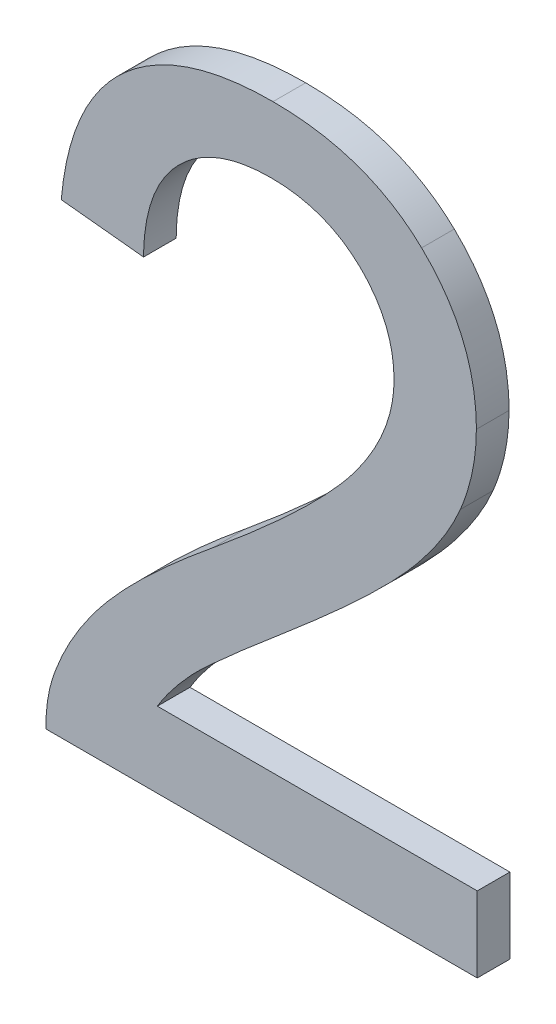
ISO-10303-21;
HEADER;
FILE_DESCRIPTION(('STEP AP214'),'2;1');
FILE_NAME('part.step','',(''),(''),'','','');
FILE_SCHEMA(('AUTOMOTIVE_DESIGN { 1 0 10303 214 1 1 1 1 }'));
ENDSEC;
DATA;
#1=APPLICATION_CONTEXT('core data for automotive mechanical design processes');
#2=APPLICATION_PROTOCOL_DEFINITION('international standard','automotive_design',2000,#1);
#3=PRODUCT_CONTEXT('',#1,'mechanical');
#4=PRODUCT('Part','Part','',(#3));
#5=PRODUCT_RELATED_PRODUCT_CATEGORY('part','',(#4));
#6=PRODUCT_DEFINITION_FORMATION('','',#4);
#7=PRODUCT_DEFINITION_CONTEXT('part definition',#1,'design');
#8=PRODUCT_DEFINITION('design','',#6,#7);
#9=PRODUCT_DEFINITION_SHAPE('','',#8);
#10=(LENGTH_UNIT() NAMED_UNIT(*) SI_UNIT(.MILLI.,.METRE.));
#11=(NAMED_UNIT(*) PLANE_ANGLE_UNIT() SI_UNIT($,.RADIAN.));
#12=(NAMED_UNIT(*) SI_UNIT($,.STERADIAN.) SOLID_ANGLE_UNIT());
#13=UNCERTAINTY_MEASURE_WITH_UNIT(LENGTH_MEASURE(1.E-05),#10,'distance_accuracy_value','');
#14=(GEOMETRIC_REPRESENTATION_CONTEXT(3) GLOBAL_UNCERTAINTY_ASSIGNED_CONTEXT((#13)) GLOBAL_UNIT_ASSIGNED_CONTEXT((#10,
#11,#12)) REPRESENTATION_CONTEXT('',''));
#15=CARTESIAN_POINT('',(0.,0.,0.));
#16=DIRECTION('',(0.,0.,1.));
#17=DIRECTION('',(1.,0.,0.));
#18=AXIS2_PLACEMENT_3D('',#15,#16,#17);
#19=CARTESIAN_POINT('',(10.434995496463,0.46657835894,0.05));
#20=DIRECTION('',(0.,0.,1.));
#21=DIRECTION('',(1.,0.,0.));
#22=AXIS2_PLACEMENT_3D('',#19,#20,#21);
#23=PLANE('',#22);
#24=DIRECTION('',(0.,-1.,0.));
#25=VECTOR('',#24,1.);
#26=CARTESIAN_POINT('',(10.746139171512,0.115552325581,0.05));
#27=LINE('',#26,#25);
#28=CARTESIAN_POINT('',(10.746139171512,0.115552325581,0.05));
#29=VERTEX_POINT('',#28);
#30=CARTESIAN_POINT('',(10.746139171512,0.,0.05));
#31=VERTEX_POINT('',#30);
#32=EDGE_CURVE('E527',#29,#31,#27,.T.);
#33=ORIENTED_EDGE('',*,*,#32,.F.);
#34=DIRECTION('',(1.,0.,0.));
#35=VECTOR('',#34,1.);
#36=CARTESIAN_POINT('',(10.256268168605,0.115552325581,0.05));
#37=LINE('',#36,#35);
#38=CARTESIAN_POINT('',(10.256268168605,0.115552325581,0.05));
#39=VERTEX_POINT('',#38);
#40=EDGE_CURVE('E258',#39,#29,#37,.T.);
#41=ORIENTED_EDGE('',*,*,#40,.F.);
#42=CARTESIAN_POINT('',(10.30804869186,0.182458212209,0.05));
#43=CARTESIAN_POINT('',(10.276707848837,0.149164244186,0.05));
#44=CARTESIAN_POINT('',(10.256268168605,0.115552325581,0.05));
#45=(BOUNDED_CURVE() B_SPLINE_CURVE(2,(#42,#43,#44),.UNSPECIFIED.,.F.,
.F.) B_SPLINE_CURVE_WITH_KNOTS((3,3),(0.,1.),
.UNSPECIFIED.) CURVE() GEOMETRIC_REPRESENTATION_ITEM() RATIONAL_B_SPLINE_CURVE((1.,1.,1.)) REPRESENTATION_ITEM(''));
#46=CARTESIAN_POINT('',(10.30804869186,0.182458212209,0.05));
#47=VERTEX_POINT('',#46);
#48=EDGE_CURVE('E244',#47,#39,#45,.T.);
#49=ORIENTED_EDGE('',*,*,#48,.F.);
#50=CARTESIAN_POINT('',(10.44976380814,0.309047965116,0.05));
#51=CARTESIAN_POINT('',(10.339389534884,0.215752180233,0.05));
#52=CARTESIAN_POINT('',(10.30804869186,0.182458212209,0.05));
#53=(BOUNDED_CURVE() B_SPLINE_CURVE(2,(#50,#51,#52),.UNSPECIFIED.,.F.,
.F.) B_SPLINE_CURVE_WITH_KNOTS((3,3),(0.,1.),
.UNSPECIFIED.) CURVE() GEOMETRIC_REPRESENTATION_ITEM() RATIONAL_B_SPLINE_CURVE((1.,1.,1.)) REPRESENTATION_ITEM(''));
#54=CARTESIAN_POINT('',(10.44976380814,0.309047965116,0.05));
#55=VERTEX_POINT('',#54);
#56=EDGE_CURVE('E233',#55,#47,#53,.T.);
#57=ORIENTED_EDGE('',*,*,#56,.F.);
#58=CARTESIAN_POINT('',(10.638808139535,0.48578306686,0.05));
#59=CARTESIAN_POINT('',(10.581940406977,0.421420784884,0.05));
#60=CARTESIAN_POINT('',(10.44976380814,0.309047965116,0.05));
#61=(BOUNDED_CURVE() B_SPLINE_CURVE(2,(#58,#59,#60),.UNSPECIFIED.,.F.,
.F.) B_SPLINE_CURVE_WITH_KNOTS((3,3),(0.,1.),
.UNSPECIFIED.) CURVE() GEOMETRIC_REPRESENTATION_ITEM() RATIONAL_B_SPLINE_CURVE((1.,1.,1.)) REPRESENTATION_ITEM(''));
#62=CARTESIAN_POINT('',(10.638808139535,0.48578306686,0.05));
#63=VERTEX_POINT('',#62);
#64=EDGE_CURVE('E368',#63,#55,#61,.T.);
#65=ORIENTED_EDGE('',*,*,#64,.F.);
#66=CARTESIAN_POINT('',(10.720248909884,0.608421148256,0.05));
#67=CARTESIAN_POINT('',(10.695721293605,0.550190770349,0.05));
#68=CARTESIAN_POINT('',(10.638808139535,0.48578306686,0.05));
#69=(BOUNDED_CURVE() B_SPLINE_CURVE(2,(#66,#67,#68),.UNSPECIFIED.,.F.,
.F.) B_SPLINE_CURVE_WITH_KNOTS((3,3),(0.,1.),
.UNSPECIFIED.) CURVE() GEOMETRIC_REPRESENTATION_ITEM() RATIONAL_B_SPLINE_CURVE((1.,1.,1.)) REPRESENTATION_ITEM(''));
#70=CARTESIAN_POINT('',(10.720248909884,0.608421148256,0.05));
#71=VERTEX_POINT('',#70);
#72=EDGE_CURVE('E430',#71,#63,#69,.T.);
#73=ORIENTED_EDGE('',*,*,#72,.F.);
#74=CARTESIAN_POINT('',(10.744776526163,0.726971293605,0.05));
#75=CARTESIAN_POINT('',(10.744776526163,0.666696947674,0.05));
#76=CARTESIAN_POINT('',(10.720248909884,0.608421148256,0.05));
#77=(BOUNDED_CURVE() B_SPLINE_CURVE(2,(#74,#75,#76),.UNSPECIFIED.,.F.,
.F.) B_SPLINE_CURVE_WITH_KNOTS((3,3),(0.,1.),
.UNSPECIFIED.) CURVE() GEOMETRIC_REPRESENTATION_ITEM() RATIONAL_B_SPLINE_CURVE((1.,1.,1.)) REPRESENTATION_ITEM(''));
#78=CARTESIAN_POINT('',(10.744776526163,0.726971293605,0.05));
#79=VERTEX_POINT('',#78);
#80=EDGE_CURVE('E359',#79,#71,#77,.T.);
#81=ORIENTED_EDGE('',*,*,#80,.F.);
#82=CARTESIAN_POINT('',(10.660973837209,0.925644985465,0.05));
#83=CARTESIAN_POINT('',(10.744776526163,0.845476017442,0.05));
#84=CARTESIAN_POINT('',(10.744776526163,0.726971293605,0.05));
#85=(BOUNDED_CURVE() B_SPLINE_CURVE(2,(#82,#83,#84),.UNSPECIFIED.,.F.,
.F.) B_SPLINE_CURVE_WITH_KNOTS((3,3),(0.,1.),
.UNSPECIFIED.) CURVE() GEOMETRIC_REPRESENTATION_ITEM() RATIONAL_B_SPLINE_CURVE((1.,1.,1.)) REPRESENTATION_ITEM(''));
#86=CARTESIAN_POINT('',(10.660973837209,0.925644985465,0.05));
#87=VERTEX_POINT('',#86);
#88=EDGE_CURVE('E267',#87,#79,#85,.T.);
#89=ORIENTED_EDGE('',*,*,#88,.F.);
#90=CARTESIAN_POINT('',(10.433412063953,1.005813953488,0.05));
#91=CARTESIAN_POINT('',(10.577171148256,1.005813953488,0.05));
#92=CARTESIAN_POINT('',(10.660973837209,0.925644985465,0.05));
#93=(BOUNDED_CURVE() B_SPLINE_CURVE(2,(#90,#91,#92),.UNSPECIFIED.,.F.,
.F.) B_SPLINE_CURVE_WITH_KNOTS((3,3),(0.,1.),
.UNSPECIFIED.) CURVE() GEOMETRIC_REPRESENTATION_ITEM() RATIONAL_B_SPLINE_CURVE((1.,1.,1.)) REPRESENTATION_ITEM(''));
#94=CARTESIAN_POINT('',(10.433412063953,1.005813953488,0.05));
#95=VERTEX_POINT('',#94);
#96=EDGE_CURVE('E275',#95,#87,#93,.T.);
#97=ORIENTED_EDGE('',*,*,#96,.F.);
#98=CARTESIAN_POINT('',(10.206531613372,0.931050145349,0.05));
#99=CARTESIAN_POINT('',(10.291015625,1.005813953488,0.05));
#100=CARTESIAN_POINT('',(10.433412063953,1.005813953488,0.05));
#101=(BOUNDED_CURVE() B_SPLINE_CURVE(2,(#98,#99,#100),.UNSPECIFIED.,.F.,
.F.) B_SPLINE_CURVE_WITH_KNOTS((3,3),(0.,1.),
.UNSPECIFIED.) CURVE() GEOMETRIC_REPRESENTATION_ITEM() RATIONAL_B_SPLINE_CURVE((1.,1.,1.)) REPRESENTATION_ITEM(''));
#102=CARTESIAN_POINT('',(10.206531613372,0.931050145349,0.05));
#103=VERTEX_POINT('',#102);
#104=EDGE_CURVE('E396',#103,#95,#101,.T.);
#105=ORIENTED_EDGE('',*,*,#104,.F.);
#106=CARTESIAN_POINT('',(10.10910247093,0.713662790698,0.05));
#107=CARTESIAN_POINT('',(10.122047601744,0.856286337209,0.05));
#108=CARTESIAN_POINT('',(10.206531613372,0.931050145349,0.05));
#109=(BOUNDED_CURVE() B_SPLINE_CURVE(2,(#106,#107,#108),.UNSPECIFIED.,.F.,
.F.) B_SPLINE_CURVE_WITH_KNOTS((3,3),(0.,1.),
.UNSPECIFIED.) CURVE() GEOMETRIC_REPRESENTATION_ITEM() RATIONAL_B_SPLINE_CURVE((1.,1.,1.)) REPRESENTATION_ITEM(''));
#110=CARTESIAN_POINT('',(10.10910247093,0.713662790698,0.05));
#111=VERTEX_POINT('',#110);
#112=EDGE_CURVE('E276',#111,#103,#109,.T.);
#113=ORIENTED_EDGE('',*,*,#112,.F.);
#114=DIRECTION('',(-0.994657582262854,0.103229327455985,0.));
#115=VECTOR('',#114,1.);
#116=CARTESIAN_POINT('',(10.235147165698,0.700581395349,0.05));
#117=LINE('',#116,#115);
#118=CARTESIAN_POINT('',(10.235147165698,0.700581395349,0.05));
#119=VERTEX_POINT('',#118);
#120=EDGE_CURVE('E311',#119,#111,#117,.T.);
#121=ORIENTED_EDGE('',*,*,#120,.F.);
#122=CARTESIAN_POINT('',(10.288971656977,0.849518531977,0.05));
#123=CARTESIAN_POINT('',(10.235828488372,0.795739462209,0.05));
#124=CARTESIAN_POINT('',(10.235147165698,0.700581395349,0.05));
#125=(BOUNDED_CURVE() B_SPLINE_CURVE(2,(#122,#123,#124),.UNSPECIFIED.,.F.,
.F.) B_SPLINE_CURVE_WITH_KNOTS((3,3),(0.,1.),
.UNSPECIFIED.) CURVE() GEOMETRIC_REPRESENTATION_ITEM() RATIONAL_B_SPLINE_CURVE((1.,1.,1.)) REPRESENTATION_ITEM(''));
#126=CARTESIAN_POINT('',(10.288971656977,0.849518531977,0.05));
#127=VERTEX_POINT('',#126);
#128=EDGE_CURVE('E194',#127,#119,#125,.T.);
#129=ORIENTED_EDGE('',*,*,#128,.F.);
#130=CARTESIAN_POINT('',(10.430686773256,0.903343023256,0.05));
#131=CARTESIAN_POINT('',(10.342114825581,0.903343023256,0.05));
#132=CARTESIAN_POINT('',(10.288971656977,0.849518531977,0.05));
#133=(BOUNDED_CURVE() B_SPLINE_CURVE(2,(#130,#131,#132),.UNSPECIFIED.,.F.,
.F.) B_SPLINE_CURVE_WITH_KNOTS((3,3),(0.,1.),
.UNSPECIFIED.) CURVE() GEOMETRIC_REPRESENTATION_ITEM() RATIONAL_B_SPLINE_CURVE((1.,1.,1.)) REPRESENTATION_ITEM(''));
#134=CARTESIAN_POINT('',(10.430686773256,0.903343023256,0.05));
#135=VERTEX_POINT('',#134);
#136=EDGE_CURVE('E461',#135,#127,#133,.T.);
#137=ORIENTED_EDGE('',*,*,#136,.F.);
#138=CARTESIAN_POINT('',(10.566587936047,0.85297056686,0.05));
#139=CARTESIAN_POINT('',(10.514489462209,0.903343023256,0.05));
#140=CARTESIAN_POINT('',(10.430686773256,0.903343023256,0.05));
#141=(BOUNDED_CURVE() B_SPLINE_CURVE(2,(#138,#139,#140),.UNSPECIFIED.,.F.,
.F.) B_SPLINE_CURVE_WITH_KNOTS((3,3),(0.,1.),
.UNSPECIFIED.) CURVE() GEOMETRIC_REPRESENTATION_ITEM() RATIONAL_B_SPLINE_CURVE((1.,1.,1.)) REPRESENTATION_ITEM(''));
#142=CARTESIAN_POINT('',(10.566587936047,0.85297056686,0.05));
#143=VERTEX_POINT('',#142);
#144=EDGE_CURVE('E312',#143,#135,#141,.T.);
#145=ORIENTED_EDGE('',*,*,#144,.F.);
#146=CARTESIAN_POINT('',(10.618731831395,0.729333212209,0.05));
#147=CARTESIAN_POINT('',(10.618731831395,0.802643531977,0.05));
#148=CARTESIAN_POINT('',(10.566587936047,0.85297056686,0.05));
#149=(BOUNDED_CURVE() B_SPLINE_CURVE(2,(#146,#147,#148),.UNSPECIFIED.,.F.,
.F.) B_SPLINE_CURVE_WITH_KNOTS((3,3),(0.,1.),
.UNSPECIFIED.) CURVE() GEOMETRIC_REPRESENTATION_ITEM() RATIONAL_B_SPLINE_CURVE((1.,1.,1.)) REPRESENTATION_ITEM(''));
#150=CARTESIAN_POINT('',(10.618731831395,0.729333212209,0.05));
#151=VERTEX_POINT('',#150);
#152=EDGE_CURVE('E403',#151,#143,#149,.T.);
#153=ORIENTED_EDGE('',*,*,#152,.F.);
#154=CARTESIAN_POINT('',(10.561500726744,0.581031976744,0.05));
#155=CARTESIAN_POINT('',(10.618731831395,0.659474927326,0.05));
#156=CARTESIAN_POINT('',(10.618731831395,0.729333212209,0.05));
#157=(BOUNDED_CURVE() B_SPLINE_CURVE(2,(#154,#155,#156),.UNSPECIFIED.,.F.,
.F.) B_SPLINE_CURVE_WITH_KNOTS((3,3),(0.,1.),
.UNSPECIFIED.) CURVE() GEOMETRIC_REPRESENTATION_ITEM() RATIONAL_B_SPLINE_CURVE((1.,1.,1.)) REPRESENTATION_ITEM(''));
#158=CARTESIAN_POINT('',(10.561500726744,0.581031976744,0.05));
#159=VERTEX_POINT('',#158);
#160=EDGE_CURVE('E327',#159,#151,#157,.T.);
#161=ORIENTED_EDGE('',*,*,#160,.F.);
#162=CARTESIAN_POINT('',(10.341433502907,0.368323037791,0.05));
#163=CARTESIAN_POINT('',(10.504269622093,0.502589026163,0.05));
#164=CARTESIAN_POINT('',(10.561500726744,0.581031976744,0.05));
#165=(BOUNDED_CURVE() B_SPLINE_CURVE(2,(#162,#163,#164),.UNSPECIFIED.,.F.,
.F.) B_SPLINE_CURVE_WITH_KNOTS((3,3),(0.,1.),
.UNSPECIFIED.) CURVE() GEOMETRIC_REPRESENTATION_ITEM() RATIONAL_B_SPLINE_CURVE((1.,1.,1.)) REPRESENTATION_ITEM(''));
#166=CARTESIAN_POINT('',(10.341433502907,0.368323037791,0.05));
#167=VERTEX_POINT('',#166);
#168=EDGE_CURVE('E293',#167,#159,#165,.T.);
#169=ORIENTED_EDGE('',*,*,#168,.F.);
#170=CARTESIAN_POINT('',(10.180959302326,0.217432776163,0.05));
#171=CARTESIAN_POINT('',(10.236509811047,0.282703488372,0.05));
#172=CARTESIAN_POINT('',(10.341433502907,0.368323037791,0.05));
#173=(BOUNDED_CURVE() B_SPLINE_CURVE(2,(#170,#171,#172),.UNSPECIFIED.,.F.,
.F.) B_SPLINE_CURVE_WITH_KNOTS((3,3),(0.,1.),
.UNSPECIFIED.) CURVE() GEOMETRIC_REPRESENTATION_ITEM() RATIONAL_B_SPLINE_CURVE((1.,1.,1.)) REPRESENTATION_ITEM(''));
#174=CARTESIAN_POINT('',(10.180959302326,0.217432776163,0.05));
#175=VERTEX_POINT('',#174);
#176=EDGE_CURVE('E294',#175,#167,#173,.T.);
#177=ORIENTED_EDGE('',*,*,#176,.F.);
#178=CARTESIAN_POINT('',(10.100245276163,0.08493822674419,0.05));
#179=CARTESIAN_POINT('',(10.125454215116,0.152207485465,0.05));
#180=CARTESIAN_POINT('',(10.180959302326,0.217432776163,0.05));
#181=(BOUNDED_CURVE() B_SPLINE_CURVE(2,(#178,#179,#180),.UNSPECIFIED.,.F.,
.F.) B_SPLINE_CURVE_WITH_KNOTS((3,3),(0.,1.),
.UNSPECIFIED.) CURVE() GEOMETRIC_REPRESENTATION_ITEM() RATIONAL_B_SPLINE_CURVE((1.,1.,1.)) REPRESENTATION_ITEM(''));
#182=CARTESIAN_POINT('',(10.100245276163,0.08493822674419,0.05));
#183=VERTEX_POINT('',#182);
#184=EDGE_CURVE('E478',#183,#175,#181,.T.);
#185=ORIENTED_EDGE('',*,*,#184,.F.);
#186=CARTESIAN_POINT('',(10.0859375,0.,0.05));
#187=CARTESIAN_POINT('',(10.084574854651,0.04414970930233,0.05));
#188=CARTESIAN_POINT('',(10.100245276163,0.08493822674419,0.05));
#189=(BOUNDED_CURVE() B_SPLINE_CURVE(2,(#186,#187,#188),.UNSPECIFIED.,.F.,
.F.) B_SPLINE_CURVE_WITH_KNOTS((3,3),(0.,1.),
.UNSPECIFIED.) CURVE() GEOMETRIC_REPRESENTATION_ITEM() RATIONAL_B_SPLINE_CURVE((1.,1.,1.)) REPRESENTATION_ITEM(''));
#190=CARTESIAN_POINT('',(10.0859375,0.,0.05));
#191=VERTEX_POINT('',#190);
#192=EDGE_CURVE('E383',#191,#183,#189,.T.);
#193=ORIENTED_EDGE('',*,*,#192,.F.);
#194=DIRECTION('',(-1.,0.,0.));
#195=VECTOR('',#194,1.);
#196=CARTESIAN_POINT('',(10.746139171512,0.,0.05));
#197=LINE('',#196,#195);
#198=EDGE_CURVE('E29',#31,#191,#197,.T.);
#199=ORIENTED_EDGE('',*,*,#198,.F.);
#200=EDGE_LOOP('',(#33,#41,#49,#57,#65,#73,#81,#89,#97,#105,#113,#121,#129,#137,#145,#153,#161,
#169,#177,#185,#193,#199));
#201=FACE_BOUND('',#200,.T.);
#202=ADVANCED_FACE('F17',(#201),#23,.T.);
#203=CARTESIAN_POINT('',(10.434995496463,0.46657835894,0.));
#204=DIRECTION('',(0.,0.,1.));
#205=DIRECTION('',(1.,0.,0.));
#206=AXIS2_PLACEMENT_3D('',#203,#204,#205);
#207=PLANE('',#206);
#208=DIRECTION('',(-1.,0.,0.));
#209=VECTOR('',#208,1.);
#210=CARTESIAN_POINT('',(10.746139171512,0.,0.));
#211=LINE('',#210,#209);
#212=CARTESIAN_POINT('',(10.746139171512,0.,0.));
#213=VERTEX_POINT('',#212);
#214=CARTESIAN_POINT('',(10.0859375,0.,0.));
#215=VERTEX_POINT('',#214);
#216=EDGE_CURVE('E11',#213,#215,#211,.T.);
#217=ORIENTED_EDGE('',*,*,#216,.T.);
#218=CARTESIAN_POINT('',(10.0859375,0.,0.));
#219=CARTESIAN_POINT('',(10.084574854651,0.04414970930233,0.));
#220=CARTESIAN_POINT('',(10.100245276163,0.08493822674419,0.));
#221=(BOUNDED_CURVE() B_SPLINE_CURVE(2,(#218,#219,#220),.UNSPECIFIED.,.F.,
.F.) B_SPLINE_CURVE_WITH_KNOTS((3,3),(0.,1.),
.UNSPECIFIED.) CURVE() GEOMETRIC_REPRESENTATION_ITEM() RATIONAL_B_SPLINE_CURVE((1.,1.,1.)) REPRESENTATION_ITEM(''));
#222=CARTESIAN_POINT('',(10.100245276163,0.08493822674419,0.));
#223=VERTEX_POINT('',#222);
#224=EDGE_CURVE('E495',#215,#223,#221,.T.);
#225=ORIENTED_EDGE('',*,*,#224,.T.);
#226=CARTESIAN_POINT('',(10.100245276163,0.08493822674419,0.));
#227=CARTESIAN_POINT('',(10.125454215116,0.152207485465,0.));
#228=CARTESIAN_POINT('',(10.180959302326,0.217432776163,0.));
#229=(BOUNDED_CURVE() B_SPLINE_CURVE(2,(#226,#227,#228),.UNSPECIFIED.,.F.,
.F.) B_SPLINE_CURVE_WITH_KNOTS((3,3),(0.,1.),
.UNSPECIFIED.) CURVE() GEOMETRIC_REPRESENTATION_ITEM() RATIONAL_B_SPLINE_CURVE((1.,1.,1.)) REPRESENTATION_ITEM(''));
#230=CARTESIAN_POINT('',(10.180959302326,0.217432776163,0.));
#231=VERTEX_POINT('',#230);
#232=EDGE_CURVE('E384',#223,#231,#229,.T.);
#233=ORIENTED_EDGE('',*,*,#232,.T.);
#234=CARTESIAN_POINT('',(10.180959302326,0.217432776163,0.));
#235=CARTESIAN_POINT('',(10.236509811047,0.282703488372,0.));
#236=CARTESIAN_POINT('',(10.341433502907,0.368323037791,0.));
#237=(BOUNDED_CURVE() B_SPLINE_CURVE(2,(#234,#235,#236),.UNSPECIFIED.,.F.,
.F.) B_SPLINE_CURVE_WITH_KNOTS((3,3),(0.,1.),
.UNSPECIFIED.) CURVE() GEOMETRIC_REPRESENTATION_ITEM() RATIONAL_B_SPLINE_CURVE((1.,1.,1.)) REPRESENTATION_ITEM(''));
#238=CARTESIAN_POINT('',(10.341433502907,0.368323037791,0.));
#239=VERTEX_POINT('',#238);
#240=EDGE_CURVE('E303',#231,#239,#237,.T.);
#241=ORIENTED_EDGE('',*,*,#240,.T.);
#242=CARTESIAN_POINT('',(10.341433502907,0.368323037791,0.));
#243=CARTESIAN_POINT('',(10.504269622093,0.502589026163,0.));
#244=CARTESIAN_POINT('',(10.561500726744,0.581031976744,0.));
#245=(BOUNDED_CURVE() B_SPLINE_CURVE(2,(#242,#243,#244),.UNSPECIFIED.,.F.,
.F.) B_SPLINE_CURVE_WITH_KNOTS((3,3),(0.,1.),
.UNSPECIFIED.) CURVE() GEOMETRIC_REPRESENTATION_ITEM() RATIONAL_B_SPLINE_CURVE((1.,1.,1.)) REPRESENTATION_ITEM(''));
#246=CARTESIAN_POINT('',(10.561500726744,0.581031976744,0.));
#247=VERTEX_POINT('',#246);
#248=EDGE_CURVE('E285',#239,#247,#245,.T.);
#249=ORIENTED_EDGE('',*,*,#248,.T.);
#250=CARTESIAN_POINT('',(10.561500726744,0.581031976744,0.));
#251=CARTESIAN_POINT('',(10.618731831395,0.659474927326,0.));
#252=CARTESIAN_POINT('',(10.618731831395,0.729333212209,0.));
#253=(BOUNDED_CURVE() B_SPLINE_CURVE(2,(#250,#251,#252),.UNSPECIFIED.,.F.,
.F.) B_SPLINE_CURVE_WITH_KNOTS((3,3),(0.,1.),
.UNSPECIFIED.) CURVE() GEOMETRIC_REPRESENTATION_ITEM() RATIONAL_B_SPLINE_CURVE((1.,1.,1.)) REPRESENTATION_ITEM(''));
#254=CARTESIAN_POINT('',(10.618731831395,0.729333212209,0.));
#255=VERTEX_POINT('',#254);
#256=EDGE_CURVE('E335',#247,#255,#253,.T.);
#257=ORIENTED_EDGE('',*,*,#256,.T.);
#258=CARTESIAN_POINT('',(10.618731831395,0.729333212209,0.));
#259=CARTESIAN_POINT('',(10.618731831395,0.802643531977,0.));
#260=CARTESIAN_POINT('',(10.566587936047,0.85297056686,0.));
#261=(BOUNDED_CURVE() B_SPLINE_CURVE(2,(#258,#259,#260),.UNSPECIFIED.,.F.,
.F.) B_SPLINE_CURVE_WITH_KNOTS((3,3),(0.,1.),
.UNSPECIFIED.) CURVE() GEOMETRIC_REPRESENTATION_ITEM() RATIONAL_B_SPLINE_CURVE((1.,1.,1.)) REPRESENTATION_ITEM(''));
#262=CARTESIAN_POINT('',(10.566587936047,0.85297056686,0.));
#263=VERTEX_POINT('',#262);
#264=EDGE_CURVE('E418',#255,#263,#261,.T.);
#265=ORIENTED_EDGE('',*,*,#264,.T.);
#266=CARTESIAN_POINT('',(10.566587936047,0.85297056686,0.));
#267=CARTESIAN_POINT('',(10.514489462209,0.903343023256,0.));
#268=CARTESIAN_POINT('',(10.430686773256,0.903343023256,0.));
#269=(BOUNDED_CURVE() B_SPLINE_CURVE(2,(#266,#267,#268),.UNSPECIFIED.,.F.,
.F.) B_SPLINE_CURVE_WITH_KNOTS((3,3),(0.,1.),
.UNSPECIFIED.) CURVE() GEOMETRIC_REPRESENTATION_ITEM() RATIONAL_B_SPLINE_CURVE((1.,1.,1.)) REPRESENTATION_ITEM(''));
#270=CARTESIAN_POINT('',(10.430686773256,0.903343023256,0.));
#271=VERTEX_POINT('',#270);
#272=EDGE_CURVE('E317',#263,#271,#269,.T.);
#273=ORIENTED_EDGE('',*,*,#272,.T.);
#274=CARTESIAN_POINT('',(10.430686773256,0.903343023256,0.));
#275=CARTESIAN_POINT('',(10.342114825581,0.903343023256,0.));
#276=CARTESIAN_POINT('',(10.288971656977,0.849518531977,0.));
#277=(BOUNDED_CURVE() B_SPLINE_CURVE(2,(#274,#275,#276),.UNSPECIFIED.,.F.,
.F.) B_SPLINE_CURVE_WITH_KNOTS((3,3),(0.,1.),
.UNSPECIFIED.) CURVE() GEOMETRIC_REPRESENTATION_ITEM() RATIONAL_B_SPLINE_CURVE((1.,1.,1.)) REPRESENTATION_ITEM(''));
#278=CARTESIAN_POINT('',(10.288971656977,0.849518531977,0.));
#279=VERTEX_POINT('',#278);
#280=EDGE_CURVE('E469',#271,#279,#277,.T.);
#281=ORIENTED_EDGE('',*,*,#280,.T.);
#282=CARTESIAN_POINT('',(10.288971656977,0.849518531977,0.));
#283=CARTESIAN_POINT('',(10.235828488372,0.795739462209,0.));
#284=CARTESIAN_POINT('',(10.235147165698,0.700581395349,0.));
#285=(BOUNDED_CURVE() B_SPLINE_CURVE(2,(#282,#283,#284),.UNSPECIFIED.,.F.,
.F.) B_SPLINE_CURVE_WITH_KNOTS((3,3),(0.,1.),
.UNSPECIFIED.) CURVE() GEOMETRIC_REPRESENTATION_ITEM() RATIONAL_B_SPLINE_CURVE((1.,1.,1.)) REPRESENTATION_ITEM(''));
#286=CARTESIAN_POINT('',(10.235147165698,0.700581395349,0.));
#287=VERTEX_POINT('',#286);
#288=EDGE_CURVE('E204',#279,#287,#285,.T.);
#289=ORIENTED_EDGE('',*,*,#288,.T.);
#290=DIRECTION('',(-0.994657582262854,0.103229327455985,0.));
#291=VECTOR('',#290,1.);
#292=CARTESIAN_POINT('',(10.235147165698,0.700581395349,0.));
#293=LINE('',#292,#291);
#294=CARTESIAN_POINT('',(10.10910247093,0.713662790698,0.));
#295=VERTEX_POINT('',#294);
#296=EDGE_CURVE('E304',#287,#295,#293,.T.);
#297=ORIENTED_EDGE('',*,*,#296,.T.);
#298=CARTESIAN_POINT('',(10.10910247093,0.713662790698,0.));
#299=CARTESIAN_POINT('',(10.122047601744,0.856286337209,0.));
#300=CARTESIAN_POINT('',(10.206531613372,0.931050145349,0.));
#301=(BOUNDED_CURVE() B_SPLINE_CURVE(2,(#298,#299,#300),.UNSPECIFIED.,.F.,
.F.) B_SPLINE_CURVE_WITH_KNOTS((3,3),(0.,1.),
.UNSPECIFIED.) CURVE() GEOMETRIC_REPRESENTATION_ITEM() RATIONAL_B_SPLINE_CURVE((1.,1.,1.)) REPRESENTATION_ITEM(''));
#302=CARTESIAN_POINT('',(10.206531613372,0.931050145349,0.));
#303=VERTEX_POINT('',#302);
#304=EDGE_CURVE('E284',#295,#303,#301,.T.);
#305=ORIENTED_EDGE('',*,*,#304,.T.);
#306=CARTESIAN_POINT('',(10.206531613372,0.931050145349,0.));
#307=CARTESIAN_POINT('',(10.291015625,1.005813953488,0.));
#308=CARTESIAN_POINT('',(10.433412063953,1.005813953488,0.));
#309=(BOUNDED_CURVE() B_SPLINE_CURVE(2,(#306,#307,#308),.UNSPECIFIED.,.F.,
.F.) B_SPLINE_CURVE_WITH_KNOTS((3,3),(0.,1.),
.UNSPECIFIED.) CURVE() GEOMETRIC_REPRESENTATION_ITEM() RATIONAL_B_SPLINE_CURVE((1.,1.,1.)) REPRESENTATION_ITEM(''));
#310=CARTESIAN_POINT('',(10.433412063953,1.005813953488,0.));
#311=VERTEX_POINT('',#310);
#312=EDGE_CURVE('E388',#303,#311,#309,.T.);
#313=ORIENTED_EDGE('',*,*,#312,.T.);
#314=CARTESIAN_POINT('',(10.433412063953,1.005813953488,0.));
#315=CARTESIAN_POINT('',(10.577171148256,1.005813953488,0.));
#316=CARTESIAN_POINT('',(10.660973837209,0.925644985465,0.));
#317=(BOUNDED_CURVE() B_SPLINE_CURVE(2,(#314,#315,#316),.UNSPECIFIED.,.F.,
.F.) B_SPLINE_CURVE_WITH_KNOTS((3,3),(0.,1.),
.UNSPECIFIED.) CURVE() GEOMETRIC_REPRESENTATION_ITEM() RATIONAL_B_SPLINE_CURVE((1.,1.,1.)) REPRESENTATION_ITEM(''));
#318=CARTESIAN_POINT('',(10.660973837209,0.925644985465,0.));
#319=VERTEX_POINT('',#318);
#320=EDGE_CURVE('E269',#311,#319,#317,.T.);
#321=ORIENTED_EDGE('',*,*,#320,.T.);
#322=CARTESIAN_POINT('',(10.660973837209,0.925644985465,0.));
#323=CARTESIAN_POINT('',(10.744776526163,0.845476017442,0.));
#324=CARTESIAN_POINT('',(10.744776526163,0.726971293605,0.));
#325=(BOUNDED_CURVE() B_SPLINE_CURVE(2,(#322,#323,#324),.UNSPECIFIED.,.F.,
.F.) B_SPLINE_CURVE_WITH_KNOTS((3,3),(0.,1.),
.UNSPECIFIED.) CURVE() GEOMETRIC_REPRESENTATION_ITEM() RATIONAL_B_SPLINE_CURVE((1.,1.,1.)) REPRESENTATION_ITEM(''));
#326=CARTESIAN_POINT('',(10.744776526163,0.726971293605,0.));
#327=VERTEX_POINT('',#326);
#328=EDGE_CURVE('E358',#319,#327,#325,.T.);
#329=ORIENTED_EDGE('',*,*,#328,.T.);
#330=CARTESIAN_POINT('',(10.744776526163,0.726971293605,0.));
#331=CARTESIAN_POINT('',(10.744776526163,0.666696947674,0.));
#332=CARTESIAN_POINT('',(10.720248909884,0.608421148256,0.));
#333=(BOUNDED_CURVE() B_SPLINE_CURVE(2,(#330,#331,#332),.UNSPECIFIED.,.F.,
.F.) B_SPLINE_CURVE_WITH_KNOTS((3,3),(0.,1.),
.UNSPECIFIED.) CURVE() GEOMETRIC_REPRESENTATION_ITEM() RATIONAL_B_SPLINE_CURVE((1.,1.,1.)) REPRESENTATION_ITEM(''));
#334=CARTESIAN_POINT('',(10.720248909884,0.608421148256,0.));
#335=VERTEX_POINT('',#334);
#336=EDGE_CURVE('E268',#327,#335,#333,.T.);
#337=ORIENTED_EDGE('',*,*,#336,.T.);
#338=CARTESIAN_POINT('',(10.720248909884,0.608421148256,0.));
#339=CARTESIAN_POINT('',(10.695721293605,0.550190770349,0.));
#340=CARTESIAN_POINT('',(10.638808139535,0.48578306686,0.));
#341=(BOUNDED_CURVE() B_SPLINE_CURVE(2,(#338,#339,#340),.UNSPECIFIED.,.F.,
.F.) B_SPLINE_CURVE_WITH_KNOTS((3,3),(0.,1.),
.UNSPECIFIED.) CURVE() GEOMETRIC_REPRESENTATION_ITEM() RATIONAL_B_SPLINE_CURVE((1.,1.,1.)) REPRESENTATION_ITEM(''));
#342=CARTESIAN_POINT('',(10.638808139535,0.48578306686,0.));
#343=VERTEX_POINT('',#342);
#344=EDGE_CURVE('E431',#335,#343,#341,.T.);
#345=ORIENTED_EDGE('',*,*,#344,.T.);
#346=CARTESIAN_POINT('',(10.638808139535,0.48578306686,0.));
#347=CARTESIAN_POINT('',(10.581940406977,0.421420784884,0.));
#348=CARTESIAN_POINT('',(10.44976380814,0.309047965116,0.));
#349=(BOUNDED_CURVE() B_SPLINE_CURVE(2,(#346,#347,#348),.UNSPECIFIED.,.F.,
.F.) B_SPLINE_CURVE_WITH_KNOTS((3,3),(0.,1.),
.UNSPECIFIED.) CURVE() GEOMETRIC_REPRESENTATION_ITEM() RATIONAL_B_SPLINE_CURVE((1.,1.,1.)) REPRESENTATION_ITEM(''));
#350=CARTESIAN_POINT('',(10.44976380814,0.309047965116,0.));
#351=VERTEX_POINT('',#350);
#352=EDGE_CURVE('E226',#343,#351,#349,.T.);
#353=ORIENTED_EDGE('',*,*,#352,.T.);
#354=CARTESIAN_POINT('',(10.44976380814,0.309047965116,0.));
#355=CARTESIAN_POINT('',(10.339389534884,0.215752180233,0.));
#356=CARTESIAN_POINT('',(10.30804869186,0.182458212209,0.));
#357=(BOUNDED_CURVE() B_SPLINE_CURVE(2,(#354,#355,#356),.UNSPECIFIED.,.F.,
.F.) B_SPLINE_CURVE_WITH_KNOTS((3,3),(0.,1.),
.UNSPECIFIED.) CURVE() GEOMETRIC_REPRESENTATION_ITEM() RATIONAL_B_SPLINE_CURVE((1.,1.,1.)) REPRESENTATION_ITEM(''));
#358=CARTESIAN_POINT('',(10.30804869186,0.182458212209,0.));
#359=VERTEX_POINT('',#358);
#360=EDGE_CURVE('E220',#351,#359,#357,.T.);
#361=ORIENTED_EDGE('',*,*,#360,.T.);
#362=CARTESIAN_POINT('',(10.30804869186,0.182458212209,0.));
#363=CARTESIAN_POINT('',(10.276707848837,0.149164244186,0.));
#364=CARTESIAN_POINT('',(10.256268168605,0.115552325581,0.));
#365=(BOUNDED_CURVE() B_SPLINE_CURVE(2,(#362,#363,#364),.UNSPECIFIED.,.F.,
.F.) B_SPLINE_CURVE_WITH_KNOTS((3,3),(0.,1.),
.UNSPECIFIED.) CURVE() GEOMETRIC_REPRESENTATION_ITEM() RATIONAL_B_SPLINE_CURVE((1.,1.,1.)) REPRESENTATION_ITEM(''));
#366=CARTESIAN_POINT('',(10.256268168605,0.115552325581,0.));
#367=VERTEX_POINT('',#366);
#368=EDGE_CURVE('E223',#359,#367,#365,.T.);
#369=ORIENTED_EDGE('',*,*,#368,.T.);
#370=DIRECTION('',(1.,0.,0.));
#371=VECTOR('',#370,1.);
#372=CARTESIAN_POINT('',(10.256268168605,0.115552325581,0.));
#373=LINE('',#372,#371);
#374=CARTESIAN_POINT('',(10.746139171512,0.115552325581,0.));
#375=VERTEX_POINT('',#374);
#376=EDGE_CURVE('E250',#367,#375,#373,.T.);
#377=ORIENTED_EDGE('',*,*,#376,.T.);
#378=DIRECTION('',(0.,-1.,0.));
#379=VECTOR('',#378,1.);
#380=CARTESIAN_POINT('',(10.746139171512,0.115552325581,0.));
#381=LINE('',#380,#379);
#382=EDGE_CURVE('E337',#375,#213,#381,.T.);
#383=ORIENTED_EDGE('',*,*,#382,.T.);
#384=EDGE_LOOP('',(#217,#225,#233,#241,#249,#257,#265,#273,#281,#289,#297,#305,#313,#321,#329,
#337,#345,#353,#361,#369,#377,#383));
#385=FACE_BOUND('',#384,.T.);
#386=ADVANCED_FACE('F222',(#385),#207,.F.);
#387=CARTESIAN_POINT('',(10.746139171512,0.,0.));
#388=DIRECTION('',(0.,-1.,0.));
#389=DIRECTION('',(0.,0.,-1.));
#390=AXIS2_PLACEMENT_3D('',#387,#388,#389);
#391=PLANE('',#390);
#392=DIRECTION('',(0.,0.,1.));
#393=VECTOR('',#392,1.);
#394=CARTESIAN_POINT('',(10.746139171512,0.,0.));
#395=LINE('',#394,#393);
#396=EDGE_CURVE('E343',#213,#31,#395,.T.);
#397=ORIENTED_EDGE('',*,*,#396,.T.);
#398=ORIENTED_EDGE('',*,*,#198,.T.);
#399=DIRECTION('',(0.,0.,1.));
#400=VECTOR('',#399,1.);
#401=CARTESIAN_POINT('',(10.0859375,0.,0.));
#402=LINE('',#401,#400);
#403=EDGE_CURVE('E377',#215,#191,#402,.T.);
#404=ORIENTED_EDGE('',*,*,#403,.F.);
#405=ORIENTED_EDGE('',*,*,#216,.F.);
#406=EDGE_LOOP('',(#397,#398,#404,#405));
#407=FACE_BOUND('',#406,.T.);
#408=ADVANCED_FACE('F626',(#407),#391,.T.);
#409=CARTESIAN_POINT('',(10.0859375,0.,0.));
#410=CARTESIAN_POINT('',(10.084574854651,0.04414970930233,0.));
#411=CARTESIAN_POINT('',(10.100245276163,0.08493822674419,0.));
#412=(BOUNDED_CURVE() B_SPLINE_CURVE(2,(#409,#410,#411),.UNSPECIFIED.,.F.,
.F.) B_SPLINE_CURVE_WITH_KNOTS((3,3),(0.,1.),
.UNSPECIFIED.) CURVE() GEOMETRIC_REPRESENTATION_ITEM() RATIONAL_B_SPLINE_CURVE((1.,1.,1.)) REPRESENTATION_ITEM(''));
#413=DIRECTION('',(0.,0.,-1.));
#414=VECTOR('',#413,1.);
#415=SURFACE_OF_LINEAR_EXTRUSION('',#412,#414);
#416=ORIENTED_EDGE('',*,*,#403,.T.);
#417=ORIENTED_EDGE('',*,*,#192,.T.);
#418=DIRECTION('',(0.,0.,1.));
#419=VECTOR('',#418,1.);
#420=CARTESIAN_POINT('',(10.100245276163,0.08493822674419,0.));
#421=LINE('',#420,#419);
#422=EDGE_CURVE('E532',#223,#183,#421,.T.);
#423=ORIENTED_EDGE('',*,*,#422,.F.);
#424=ORIENTED_EDGE('',*,*,#224,.F.);
#425=EDGE_LOOP('',(#416,#417,#423,#424));
#426=FACE_BOUND('',#425,.T.);
#427=ADVANCED_FACE('F631',(#426),#415,.T.);
#428=CARTESIAN_POINT('',(10.100245276163,0.08493822674419,0.));
#429=CARTESIAN_POINT('',(10.125454215116,0.152207485465,0.));
#430=CARTESIAN_POINT('',(10.180959302326,0.217432776163,0.));
#431=(BOUNDED_CURVE() B_SPLINE_CURVE(2,(#428,#429,#430),.UNSPECIFIED.,.F.,
.F.) B_SPLINE_CURVE_WITH_KNOTS((3,3),(0.,1.),
.UNSPECIFIED.) CURVE() GEOMETRIC_REPRESENTATION_ITEM() RATIONAL_B_SPLINE_CURVE((1.,1.,1.)) REPRESENTATION_ITEM(''));
#432=DIRECTION('',(0.,0.,-1.));
#433=VECTOR('',#432,1.);
#434=SURFACE_OF_LINEAR_EXTRUSION('',#431,#433);
#435=ORIENTED_EDGE('',*,*,#422,.T.);
#436=ORIENTED_EDGE('',*,*,#184,.T.);
#437=DIRECTION('',(0.,0.,1.));
#438=VECTOR('',#437,1.);
#439=CARTESIAN_POINT('',(10.180959302326,0.217432776163,0.));
#440=LINE('',#439,#438);
#441=EDGE_CURVE('E262',#231,#175,#440,.T.);
#442=ORIENTED_EDGE('',*,*,#441,.F.);
#443=ORIENTED_EDGE('',*,*,#232,.F.);
#444=EDGE_LOOP('',(#435,#436,#442,#443));
#445=FACE_BOUND('',#444,.T.);
#446=ADVANCED_FACE('F634',(#445),#434,.T.);
#447=CARTESIAN_POINT('',(10.180959302326,0.217432776163,0.));
#448=CARTESIAN_POINT('',(10.236509811047,0.282703488372,0.));
#449=CARTESIAN_POINT('',(10.341433502907,0.368323037791,0.));
#450=(BOUNDED_CURVE() B_SPLINE_CURVE(2,(#447,#448,#449),.UNSPECIFIED.,.F.,
.F.) B_SPLINE_CURVE_WITH_KNOTS((3,3),(0.,1.),
.UNSPECIFIED.) CURVE() GEOMETRIC_REPRESENTATION_ITEM() RATIONAL_B_SPLINE_CURVE((1.,1.,1.)) REPRESENTATION_ITEM(''));
#451=DIRECTION('',(0.,0.,-1.));
#452=VECTOR('',#451,1.);
#453=SURFACE_OF_LINEAR_EXTRUSION('',#450,#452);
#454=ORIENTED_EDGE('',*,*,#441,.T.);
#455=ORIENTED_EDGE('',*,*,#176,.T.);
#456=DIRECTION('',(0.,0.,1.));
#457=VECTOR('',#456,1.);
#458=CARTESIAN_POINT('',(10.341433502907,0.368323037791,0.));
#459=LINE('',#458,#457);
#460=EDGE_CURVE('E347',#239,#167,#459,.T.);
#461=ORIENTED_EDGE('',*,*,#460,.F.);
#462=ORIENTED_EDGE('',*,*,#240,.F.);
#463=EDGE_LOOP('',(#454,#455,#461,#462));
#464=FACE_BOUND('',#463,.T.);
#465=ADVANCED_FACE('F642',(#464),#453,.T.);
#466=CARTESIAN_POINT('',(10.341433502907,0.368323037791,0.));
#467=CARTESIAN_POINT('',(10.504269622093,0.502589026163,0.));
#468=CARTESIAN_POINT('',(10.561500726744,0.581031976744,0.));
#469=(BOUNDED_CURVE() B_SPLINE_CURVE(2,(#466,#467,#468),.UNSPECIFIED.,.F.,
.F.) B_SPLINE_CURVE_WITH_KNOTS((3,3),(0.,1.),
.UNSPECIFIED.) CURVE() GEOMETRIC_REPRESENTATION_ITEM() RATIONAL_B_SPLINE_CURVE((1.,1.,1.)) REPRESENTATION_ITEM(''));
#470=DIRECTION('',(0.,0.,-1.));
#471=VECTOR('',#470,1.);
#472=SURFACE_OF_LINEAR_EXTRUSION('',#469,#471);
#473=ORIENTED_EDGE('',*,*,#460,.T.);
#474=ORIENTED_EDGE('',*,*,#168,.T.);
#475=DIRECTION('',(0.,0.,1.));
#476=VECTOR('',#475,1.);
#477=CARTESIAN_POINT('',(10.561500726744,0.581031976744,0.));
#478=LINE('',#477,#476);
#479=EDGE_CURVE('E336',#247,#159,#478,.T.);
#480=ORIENTED_EDGE('',*,*,#479,.F.);
#481=ORIENTED_EDGE('',*,*,#248,.F.);
#482=EDGE_LOOP('',(#473,#474,#480,#481));
#483=FACE_BOUND('',#482,.T.);
#484=ADVANCED_FACE('F645',(#483),#472,.T.);
#485=CARTESIAN_POINT('',(10.561500726744,0.581031976744,0.));
#486=CARTESIAN_POINT('',(10.618731831395,0.659474927326,0.));
#487=CARTESIAN_POINT('',(10.618731831395,0.729333212209,0.));
#488=(BOUNDED_CURVE() B_SPLINE_CURVE(2,(#485,#486,#487),.UNSPECIFIED.,.F.,
.F.) B_SPLINE_CURVE_WITH_KNOTS((3,3),(0.,1.),
.UNSPECIFIED.) CURVE() GEOMETRIC_REPRESENTATION_ITEM() RATIONAL_B_SPLINE_CURVE((1.,1.,1.)) REPRESENTATION_ITEM(''));
#489=DIRECTION('',(0.,0.,-1.));
#490=VECTOR('',#489,1.);
#491=SURFACE_OF_LINEAR_EXTRUSION('',#488,#490);
#492=ORIENTED_EDGE('',*,*,#479,.T.);
#493=ORIENTED_EDGE('',*,*,#160,.T.);
#494=DIRECTION('',(0.,0.,1.));
#495=VECTOR('',#494,1.);
#496=CARTESIAN_POINT('',(10.618731831395,0.729333212209,0.));
#497=LINE('',#496,#495);
#498=EDGE_CURVE('E326',#255,#151,#497,.T.);
#499=ORIENTED_EDGE('',*,*,#498,.F.);
#500=ORIENTED_EDGE('',*,*,#256,.F.);
#501=EDGE_LOOP('',(#492,#493,#499,#500));
#502=FACE_BOUND('',#501,.T.);
#503=ADVANCED_FACE('F699',(#502),#491,.T.);
#504=CARTESIAN_POINT('',(10.618731831395,0.729333212209,0.));
#505=CARTESIAN_POINT('',(10.618731831395,0.802643531977,0.));
#506=CARTESIAN_POINT('',(10.566587936047,0.85297056686,0.));
#507=(BOUNDED_CURVE() B_SPLINE_CURVE(2,(#504,#505,#506),.UNSPECIFIED.,.F.,
.F.) B_SPLINE_CURVE_WITH_KNOTS((3,3),(0.,1.),
.UNSPECIFIED.) CURVE() GEOMETRIC_REPRESENTATION_ITEM() RATIONAL_B_SPLINE_CURVE((1.,1.,1.)) REPRESENTATION_ITEM(''));
#508=DIRECTION('',(0.,0.,-1.));
#509=VECTOR('',#508,1.);
#510=SURFACE_OF_LINEAR_EXTRUSION('',#507,#509);
#511=ORIENTED_EDGE('',*,*,#498,.T.);
#512=ORIENTED_EDGE('',*,*,#152,.T.);
#513=DIRECTION('',(0.,0.,1.));
#514=VECTOR('',#513,1.);
#515=CARTESIAN_POINT('',(10.566587936047,0.85297056686,0.));
#516=LINE('',#515,#514);
#517=EDGE_CURVE('E318',#263,#143,#516,.T.);
#518=ORIENTED_EDGE('',*,*,#517,.F.);
#519=ORIENTED_EDGE('',*,*,#264,.F.);
#520=EDGE_LOOP('',(#511,#512,#518,#519));
#521=FACE_BOUND('',#520,.T.);
#522=ADVANCED_FACE('F19',(#521),#510,.T.);
#523=CARTESIAN_POINT('',(10.566587936047,0.85297056686,0.));
#524=CARTESIAN_POINT('',(10.514489462209,0.903343023256,0.));
#525=CARTESIAN_POINT('',(10.430686773256,0.903343023256,0.));
#526=(BOUNDED_CURVE() B_SPLINE_CURVE(2,(#523,#524,#525),.UNSPECIFIED.,.F.,
.F.) B_SPLINE_CURVE_WITH_KNOTS((3,3),(0.,1.),
.UNSPECIFIED.) CURVE() GEOMETRIC_REPRESENTATION_ITEM() RATIONAL_B_SPLINE_CURVE((1.,1.,1.)) REPRESENTATION_ITEM(''));
#527=DIRECTION('',(0.,0.,-1.));
#528=VECTOR('',#527,1.);
#529=SURFACE_OF_LINEAR_EXTRUSION('',#526,#528);
#530=ORIENTED_EDGE('',*,*,#517,.T.);
#531=ORIENTED_EDGE('',*,*,#144,.T.);
#532=DIRECTION('',(0.,0.,1.));
#533=VECTOR('',#532,1.);
#534=CARTESIAN_POINT('',(10.430686773256,0.903343023256,0.));
#535=LINE('',#534,#533);
#536=EDGE_CURVE('E470',#271,#135,#535,.T.);
#537=ORIENTED_EDGE('',*,*,#536,.F.);
#538=ORIENTED_EDGE('',*,*,#272,.F.);
#539=EDGE_LOOP('',(#530,#531,#537,#538));
#540=FACE_BOUND('',#539,.T.);
#541=ADVANCED_FACE('F708',(#540),#529,.T.);
#542=CARTESIAN_POINT('',(10.430686773256,0.903343023256,0.));
#543=CARTESIAN_POINT('',(10.342114825581,0.903343023256,0.));
#544=CARTESIAN_POINT('',(10.288971656977,0.849518531977,0.));
#545=(BOUNDED_CURVE() B_SPLINE_CURVE(2,(#542,#543,#544),.UNSPECIFIED.,.F.,
.F.) B_SPLINE_CURVE_WITH_KNOTS((3,3),(0.,1.),
.UNSPECIFIED.) CURVE() GEOMETRIC_REPRESENTATION_ITEM() RATIONAL_B_SPLINE_CURVE((1.,1.,1.)) REPRESENTATION_ITEM(''));
#546=DIRECTION('',(0.,0.,-1.));
#547=VECTOR('',#546,1.);
#548=SURFACE_OF_LINEAR_EXTRUSION('',#545,#547);
#549=ORIENTED_EDGE('',*,*,#536,.T.);
#550=ORIENTED_EDGE('',*,*,#136,.T.);
#551=DIRECTION('',(0.,0.,1.));
#552=VECTOR('',#551,1.);
#553=CARTESIAN_POINT('',(10.288971656977,0.849518531977,0.));
#554=LINE('',#553,#552);
#555=EDGE_CURVE('E310',#279,#127,#554,.T.);
#556=ORIENTED_EDGE('',*,*,#555,.F.);
#557=ORIENTED_EDGE('',*,*,#280,.F.);
#558=EDGE_LOOP('',(#549,#550,#556,#557));
#559=FACE_BOUND('',#558,.T.);
#560=ADVANCED_FACE('F711',(#559),#548,.T.);
#561=CARTESIAN_POINT('',(10.288971656977,0.849518531977,0.));
#562=CARTESIAN_POINT('',(10.235828488372,0.795739462209,0.));
#563=CARTESIAN_POINT('',(10.235147165698,0.700581395349,0.));
#564=(BOUNDED_CURVE() B_SPLINE_CURVE(2,(#561,#562,#563),.UNSPECIFIED.,.F.,
.F.) B_SPLINE_CURVE_WITH_KNOTS((3,3),(0.,1.),
.UNSPECIFIED.) CURVE() GEOMETRIC_REPRESENTATION_ITEM() RATIONAL_B_SPLINE_CURVE((1.,1.,1.)) REPRESENTATION_ITEM(''));
#565=DIRECTION('',(0.,0.,-1.));
#566=VECTOR('',#565,1.);
#567=SURFACE_OF_LINEAR_EXTRUSION('',#564,#566);
#568=ORIENTED_EDGE('',*,*,#555,.T.);
#569=ORIENTED_EDGE('',*,*,#128,.T.);
#570=DIRECTION('',(0.,0.,1.));
#571=VECTOR('',#570,1.);
#572=CARTESIAN_POINT('',(10.235147165698,0.700581395349,0.));
#573=LINE('',#572,#571);
#574=EDGE_CURVE('E453',#287,#119,#573,.T.);
#575=ORIENTED_EDGE('',*,*,#574,.F.);
#576=ORIENTED_EDGE('',*,*,#288,.F.);
#577=EDGE_LOOP('',(#568,#569,#575,#576));
#578=FACE_BOUND('',#577,.T.);
#579=ADVANCED_FACE('F871',(#578),#567,.T.);
#580=CARTESIAN_POINT('',(10.235147165698,0.700581395349,0.));
#581=DIRECTION('',(-0.103229327455985,-0.994657582262854,0.));
#582=DIRECTION('',(-0.994657582262854,0.103229327455985,0.));
#583=AXIS2_PLACEMENT_3D('',#580,#581,#582);
#584=PLANE('',#583);
#585=ORIENTED_EDGE('',*,*,#574,.T.);
#586=ORIENTED_EDGE('',*,*,#120,.T.);
#587=DIRECTION('',(0.,0.,1.));
#588=VECTOR('',#587,1.);
#589=CARTESIAN_POINT('',(10.10910247093,0.713662790698,0.));
#590=LINE('',#589,#588);
#591=EDGE_CURVE('E22',#295,#111,#590,.T.);
#592=ORIENTED_EDGE('',*,*,#591,.F.);
#593=ORIENTED_EDGE('',*,*,#296,.F.);
#594=EDGE_LOOP('',(#585,#586,#592,#593));
#595=FACE_BOUND('',#594,.T.);
#596=ADVANCED_FACE('F876',(#595),#584,.T.);
#597=CARTESIAN_POINT('',(10.10910247093,0.713662790698,0.));
#598=CARTESIAN_POINT('',(10.122047601744,0.856286337209,0.));
#599=CARTESIAN_POINT('',(10.206531613372,0.931050145349,0.));
#600=(BOUNDED_CURVE() B_SPLINE_CURVE(2,(#597,#598,#599),.UNSPECIFIED.,.F.,
.F.) B_SPLINE_CURVE_WITH_KNOTS((3,3),(0.,1.),
.UNSPECIFIED.) CURVE() GEOMETRIC_REPRESENTATION_ITEM() RATIONAL_B_SPLINE_CURVE((1.,1.,1.)) REPRESENTATION_ITEM(''));
#601=DIRECTION('',(0.,0.,-1.));
#602=VECTOR('',#601,1.);
#603=SURFACE_OF_LINEAR_EXTRUSION('',#600,#602);
#604=ORIENTED_EDGE('',*,*,#591,.T.);
#605=ORIENTED_EDGE('',*,*,#112,.T.);
#606=DIRECTION('',(0.,0.,1.));
#607=VECTOR('',#606,1.);
#608=CARTESIAN_POINT('',(10.206531613372,0.931050145349,0.));
#609=LINE('',#608,#607);
#610=EDGE_CURVE('E274',#303,#103,#609,.T.);
#611=ORIENTED_EDGE('',*,*,#610,.F.);
#612=ORIENTED_EDGE('',*,*,#304,.F.);
#613=EDGE_LOOP('',(#604,#605,#611,#612));
#614=FACE_BOUND('',#613,.T.);
#615=ADVANCED_FACE('F751',(#614),#603,.T.);
#616=CARTESIAN_POINT('',(10.206531613372,0.931050145349,0.));
#617=CARTESIAN_POINT('',(10.291015625,1.005813953488,0.));
#618=CARTESIAN_POINT('',(10.433412063953,1.005813953488,0.));
#619=(BOUNDED_CURVE() B_SPLINE_CURVE(2,(#616,#617,#618),.UNSPECIFIED.,.F.,
.F.) B_SPLINE_CURVE_WITH_KNOTS((3,3),(0.,1.),
.UNSPECIFIED.) CURVE() GEOMETRIC_REPRESENTATION_ITEM() RATIONAL_B_SPLINE_CURVE((1.,1.,1.)) REPRESENTATION_ITEM(''));
#620=DIRECTION('',(0.,0.,-1.));
#621=VECTOR('',#620,1.);
#622=SURFACE_OF_LINEAR_EXTRUSION('',#619,#621);
#623=ORIENTED_EDGE('',*,*,#610,.T.);
#624=ORIENTED_EDGE('',*,*,#104,.T.);
#625=DIRECTION('',(0.,0.,1.));
#626=VECTOR('',#625,1.);
#627=CARTESIAN_POINT('',(10.433412063953,1.005813953488,0.));
#628=LINE('',#627,#626);
#629=EDGE_CURVE('E449',#311,#95,#628,.T.);
#630=ORIENTED_EDGE('',*,*,#629,.F.);
#631=ORIENTED_EDGE('',*,*,#312,.F.);
#632=EDGE_LOOP('',(#623,#624,#630,#631));
#633=FACE_BOUND('',#632,.T.);
#634=ADVANCED_FACE('F747',(#633),#622,.T.);
#635=CARTESIAN_POINT('',(10.433412063953,1.005813953488,0.));
#636=CARTESIAN_POINT('',(10.577171148256,1.005813953488,0.));
#637=CARTESIAN_POINT('',(10.660973837209,0.925644985465,0.));
#638=(BOUNDED_CURVE() B_SPLINE_CURVE(2,(#635,#636,#637),.UNSPECIFIED.,.F.,
.F.) B_SPLINE_CURVE_WITH_KNOTS((3,3),(0.,1.),
.UNSPECIFIED.) CURVE() GEOMETRIC_REPRESENTATION_ITEM() RATIONAL_B_SPLINE_CURVE((1.,1.,1.)) REPRESENTATION_ITEM(''));
#639=DIRECTION('',(0.,0.,-1.));
#640=VECTOR('',#639,1.);
#641=SURFACE_OF_LINEAR_EXTRUSION('',#638,#640);
#642=ORIENTED_EDGE('',*,*,#629,.T.);
#643=ORIENTED_EDGE('',*,*,#96,.T.);
#644=DIRECTION('',(0.,0.,1.));
#645=VECTOR('',#644,1.);
#646=CARTESIAN_POINT('',(10.660973837209,0.925644985465,0.));
#647=LINE('',#646,#645);
#648=EDGE_CURVE('E264',#319,#87,#647,.T.);
#649=ORIENTED_EDGE('',*,*,#648,.F.);
#650=ORIENTED_EDGE('',*,*,#320,.F.);
#651=EDGE_LOOP('',(#642,#643,#649,#650));
#652=FACE_BOUND('',#651,.T.);
#653=ADVANCED_FACE('F750',(#652),#641,.T.);
#654=CARTESIAN_POINT('',(10.660973837209,0.925644985465,0.));
#655=CARTESIAN_POINT('',(10.744776526163,0.845476017442,0.));
#656=CARTESIAN_POINT('',(10.744776526163,0.726971293605,0.));
#657=(BOUNDED_CURVE() B_SPLINE_CURVE(2,(#654,#655,#656),.UNSPECIFIED.,.F.,
.F.) B_SPLINE_CURVE_WITH_KNOTS((3,3),(0.,1.),
.UNSPECIFIED.) CURVE() GEOMETRIC_REPRESENTATION_ITEM() RATIONAL_B_SPLINE_CURVE((1.,1.,1.)) REPRESENTATION_ITEM(''));
#658=DIRECTION('',(0.,0.,-1.));
#659=VECTOR('',#658,1.);
#660=SURFACE_OF_LINEAR_EXTRUSION('',#657,#659);
#661=ORIENTED_EDGE('',*,*,#648,.T.);
#662=ORIENTED_EDGE('',*,*,#88,.T.);
#663=DIRECTION('',(0.,0.,1.));
#664=VECTOR('',#663,1.);
#665=CARTESIAN_POINT('',(10.744776526163,0.726971293605,0.));
#666=LINE('',#665,#664);
#667=EDGE_CURVE('E367',#327,#79,#666,.T.);
#668=ORIENTED_EDGE('',*,*,#667,.F.);
#669=ORIENTED_EDGE('',*,*,#328,.F.);
#670=EDGE_LOOP('',(#661,#662,#668,#669));
#671=FACE_BOUND('',#670,.T.);
#672=ADVANCED_FACE('F757',(#671),#660,.T.);
#673=CARTESIAN_POINT('',(10.744776526163,0.726971293605,0.));
#674=CARTESIAN_POINT('',(10.744776526163,0.666696947674,0.));
#675=CARTESIAN_POINT('',(10.720248909884,0.608421148256,0.));
#676=(BOUNDED_CURVE() B_SPLINE_CURVE(2,(#673,#674,#675),.UNSPECIFIED.,.F.,
.F.) B_SPLINE_CURVE_WITH_KNOTS((3,3),(0.,1.),
.UNSPECIFIED.) CURVE() GEOMETRIC_REPRESENTATION_ITEM() RATIONAL_B_SPLINE_CURVE((1.,1.,1.)) REPRESENTATION_ITEM(''));
#677=DIRECTION('',(0.,0.,-1.));
#678=VECTOR('',#677,1.);
#679=SURFACE_OF_LINEAR_EXTRUSION('',#676,#678);
#680=ORIENTED_EDGE('',*,*,#667,.T.);
#681=ORIENTED_EDGE('',*,*,#80,.T.);
#682=DIRECTION('',(0.,0.,1.));
#683=VECTOR('',#682,1.);
#684=CARTESIAN_POINT('',(10.720248909884,0.608421148256,0.));
#685=LINE('',#684,#683);
#686=EDGE_CURVE('E423',#335,#71,#685,.T.);
#687=ORIENTED_EDGE('',*,*,#686,.F.);
#688=ORIENTED_EDGE('',*,*,#336,.F.);
#689=EDGE_LOOP('',(#680,#681,#687,#688));
#690=FACE_BOUND('',#689,.T.);
#691=ADVANCED_FACE('F753',(#690),#679,.T.);
#692=CARTESIAN_POINT('',(10.720248909884,0.608421148256,0.));
#693=CARTESIAN_POINT('',(10.695721293605,0.550190770349,0.));
#694=CARTESIAN_POINT('',(10.638808139535,0.48578306686,0.));
#695=(BOUNDED_CURVE() B_SPLINE_CURVE(2,(#692,#693,#694),.UNSPECIFIED.,.F.,
.F.) B_SPLINE_CURVE_WITH_KNOTS((3,3),(0.,1.),
.UNSPECIFIED.) CURVE() GEOMETRIC_REPRESENTATION_ITEM() RATIONAL_B_SPLINE_CURVE((1.,1.,1.)) REPRESENTATION_ITEM(''));
#696=DIRECTION('',(0.,0.,-1.));
#697=VECTOR('',#696,1.);
#698=SURFACE_OF_LINEAR_EXTRUSION('',#695,#697);
#699=ORIENTED_EDGE('',*,*,#686,.T.);
#700=ORIENTED_EDGE('',*,*,#72,.T.);
#701=DIRECTION('',(0.,0.,1.));
#702=VECTOR('',#701,1.);
#703=CARTESIAN_POINT('',(10.638808139535,0.48578306686,0.));
#704=LINE('',#703,#702);
#705=EDGE_CURVE('E232',#343,#63,#704,.T.);
#706=ORIENTED_EDGE('',*,*,#705,.F.);
#707=ORIENTED_EDGE('',*,*,#344,.F.);
#708=EDGE_LOOP('',(#699,#700,#706,#707));
#709=FACE_BOUND('',#708,.T.);
#710=ADVANCED_FACE('F756',(#709),#698,.T.);
#711=CARTESIAN_POINT('',(10.638808139535,0.48578306686,0.));
#712=CARTESIAN_POINT('',(10.581940406977,0.421420784884,0.));
#713=CARTESIAN_POINT('',(10.44976380814,0.309047965116,0.));
#714=(BOUNDED_CURVE() B_SPLINE_CURVE(2,(#711,#712,#713),.UNSPECIFIED.,.F.,
.F.) B_SPLINE_CURVE_WITH_KNOTS((3,3),(0.,1.),
.UNSPECIFIED.) CURVE() GEOMETRIC_REPRESENTATION_ITEM() RATIONAL_B_SPLINE_CURVE((1.,1.,1.)) REPRESENTATION_ITEM(''));
#715=DIRECTION('',(0.,0.,-1.));
#716=VECTOR('',#715,1.);
#717=SURFACE_OF_LINEAR_EXTRUSION('',#714,#716);
#718=ORIENTED_EDGE('',*,*,#705,.T.);
#719=ORIENTED_EDGE('',*,*,#64,.T.);
#720=DIRECTION('',(0.,0.,1.));
#721=VECTOR('',#720,1.);
#722=CARTESIAN_POINT('',(10.44976380814,0.309047965116,0.));
#723=LINE('',#722,#721);
#724=EDGE_CURVE('E243',#351,#55,#723,.T.);
#725=ORIENTED_EDGE('',*,*,#724,.F.);
#726=ORIENTED_EDGE('',*,*,#352,.F.);
#727=EDGE_LOOP('',(#718,#719,#725,#726));
#728=FACE_BOUND('',#727,.T.);
#729=ADVANCED_FACE('F612',(#728),#717,.T.);
#730=CARTESIAN_POINT('',(10.44976380814,0.309047965116,0.));
#731=CARTESIAN_POINT('',(10.339389534884,0.215752180233,0.));
#732=CARTESIAN_POINT('',(10.30804869186,0.182458212209,0.));
#733=(BOUNDED_CURVE() B_SPLINE_CURVE(2,(#730,#731,#732),.UNSPECIFIED.,.F.,
.F.) B_SPLINE_CURVE_WITH_KNOTS((3,3),(0.,1.),
.UNSPECIFIED.) CURVE() GEOMETRIC_REPRESENTATION_ITEM() RATIONAL_B_SPLINE_CURVE((1.,1.,1.)) REPRESENTATION_ITEM(''));
#734=DIRECTION('',(0.,0.,-1.));
#735=VECTOR('',#734,1.);
#736=SURFACE_OF_LINEAR_EXTRUSION('',#733,#735);
#737=ORIENTED_EDGE('',*,*,#724,.T.);
#738=ORIENTED_EDGE('',*,*,#56,.T.);
#739=DIRECTION('',(0.,0.,1.));
#740=VECTOR('',#739,1.);
#741=CARTESIAN_POINT('',(10.30804869186,0.182458212209,0.));
#742=LINE('',#741,#740);
#743=EDGE_CURVE('E239',#359,#47,#742,.T.);
#744=ORIENTED_EDGE('',*,*,#743,.F.);
#745=ORIENTED_EDGE('',*,*,#360,.F.);
#746=EDGE_LOOP('',(#737,#738,#744,#745));
#747=FACE_BOUND('',#746,.T.);
#748=ADVANCED_FACE('F246',(#747),#736,.T.);
#749=CARTESIAN_POINT('',(10.30804869186,0.182458212209,0.));
#750=CARTESIAN_POINT('',(10.276707848837,0.149164244186,0.));
#751=CARTESIAN_POINT('',(10.256268168605,0.115552325581,0.));
#752=(BOUNDED_CURVE() B_SPLINE_CURVE(2,(#749,#750,#751),.UNSPECIFIED.,.F.,
.F.) B_SPLINE_CURVE_WITH_KNOTS((3,3),(0.,1.),
.UNSPECIFIED.) CURVE() GEOMETRIC_REPRESENTATION_ITEM() RATIONAL_B_SPLINE_CURVE((1.,1.,1.)) REPRESENTATION_ITEM(''));
#753=DIRECTION('',(0.,0.,-1.));
#754=VECTOR('',#753,1.);
#755=SURFACE_OF_LINEAR_EXTRUSION('',#752,#754);
#756=ORIENTED_EDGE('',*,*,#743,.T.);
#757=ORIENTED_EDGE('',*,*,#48,.T.);
#758=DIRECTION('',(0.,0.,1.));
#759=VECTOR('',#758,1.);
#760=CARTESIAN_POINT('',(10.256268168605,0.115552325581,0.));
#761=LINE('',#760,#759);
#762=EDGE_CURVE('E241',#367,#39,#761,.T.);
#763=ORIENTED_EDGE('',*,*,#762,.F.);
#764=ORIENTED_EDGE('',*,*,#368,.F.);
#765=EDGE_LOOP('',(#756,#757,#763,#764));
#766=FACE_BOUND('',#765,.T.);
#767=ADVANCED_FACE('F238',(#766),#755,.T.);
#768=CARTESIAN_POINT('',(10.256268168605,0.115552325581,0.));
#769=DIRECTION('',(0.,1.,0.));
#770=DIRECTION('',(1.,0.,0.));
#771=AXIS2_PLACEMENT_3D('',#768,#769,#770);
#772=PLANE('',#771);
#773=ORIENTED_EDGE('',*,*,#762,.T.);
#774=ORIENTED_EDGE('',*,*,#40,.T.);
#775=DIRECTION('',(0.,0.,1.));
#776=VECTOR('',#775,1.);
#777=CARTESIAN_POINT('',(10.746139171512,0.115552325581,0.));
#778=LINE('',#777,#776);
#779=EDGE_CURVE('E520',#375,#29,#778,.T.);
#780=ORIENTED_EDGE('',*,*,#779,.F.);
#781=ORIENTED_EDGE('',*,*,#376,.F.);
#782=EDGE_LOOP('',(#773,#774,#780,#781));
#783=FACE_BOUND('',#782,.T.);
#784=ADVANCED_FACE('F621',(#783),#772,.T.);
#785=CARTESIAN_POINT('',(10.746139171512,0.115552325581,0.));
#786=DIRECTION('',(1.,0.,0.));
#787=DIRECTION('',(0.,1.,0.));
#788=AXIS2_PLACEMENT_3D('',#785,#786,#787);
#789=PLANE('',#788);
#790=ORIENTED_EDGE('',*,*,#779,.T.);
#791=ORIENTED_EDGE('',*,*,#32,.T.);
#792=ORIENTED_EDGE('',*,*,#396,.F.);
#793=ORIENTED_EDGE('',*,*,#382,.F.);
#794=EDGE_LOOP('',(#790,#791,#792,#793));
#795=FACE_BOUND('',#794,.T.);
#796=ADVANCED_FACE('F625',(#795),#789,.T.);
#797=CLOSED_SHELL('',(#202,#386,#408,#427,#446,#465,#484,#503,#522,#541,#560,#579,#596,#615,
#634,#653,#672,#691,#710,#729,#748,#767,#784,#796));
#798=MANIFOLD_SOLID_BREP('B1',#797);
#799=ADVANCED_BREP_SHAPE_REPRESENTATION('',(#18,#798),#14);
#800=SHAPE_DEFINITION_REPRESENTATION(#9,#799);
ENDSEC;
END-ISO-10303-21;
